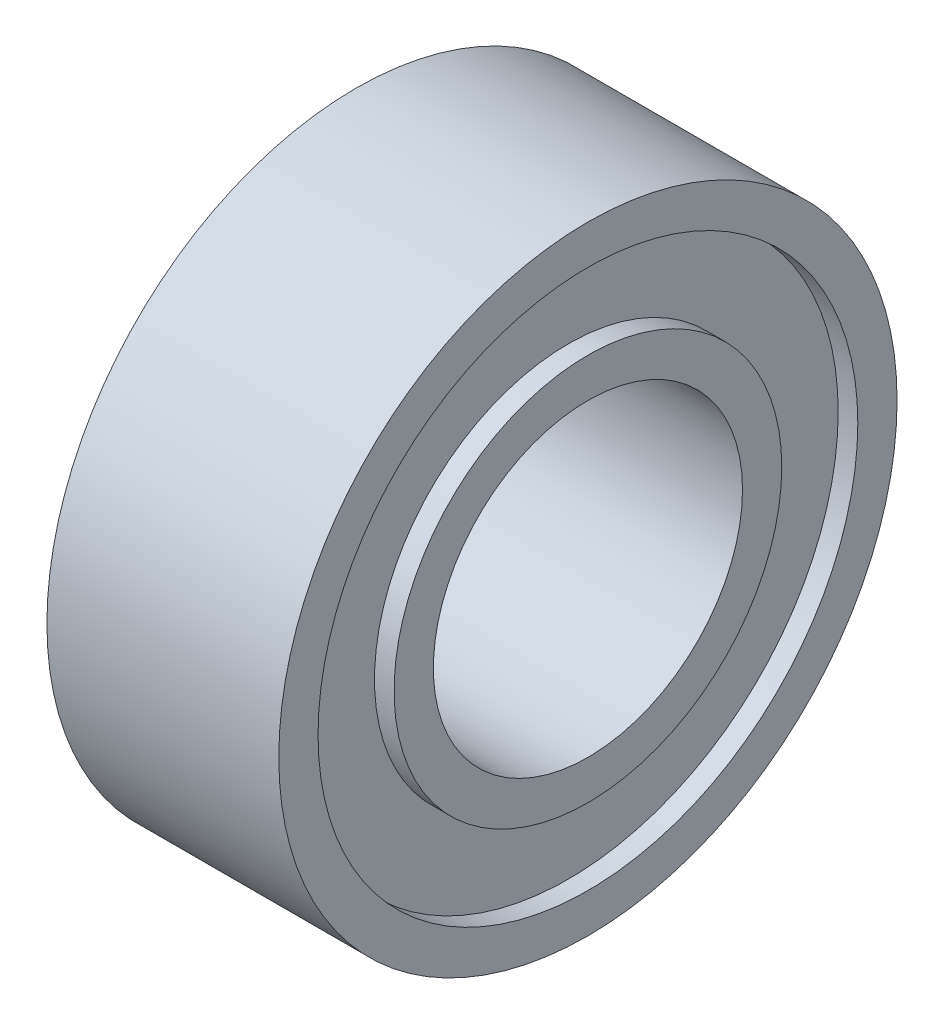
ISO-10303-21;
HEADER;
FILE_DESCRIPTION(('STEP AP214'),'2;1');
FILE_NAME('part.step','',(''),(''),'','','');
FILE_SCHEMA(('AUTOMOTIVE_DESIGN { 1 0 10303 214 1 1 1 1 }'));
ENDSEC;
DATA;
#1=APPLICATION_CONTEXT('core data for automotive mechanical design processes');
#2=APPLICATION_PROTOCOL_DEFINITION('international standard','automotive_design',2000,#1);
#3=PRODUCT_CONTEXT('',#1,'mechanical');
#4=PRODUCT('Part','Part','',(#3));
#5=PRODUCT_RELATED_PRODUCT_CATEGORY('part','',(#4));
#6=PRODUCT_DEFINITION_FORMATION('','',#4);
#7=PRODUCT_DEFINITION_CONTEXT('part definition',#1,'design');
#8=PRODUCT_DEFINITION('design','',#6,#7);
#9=PRODUCT_DEFINITION_SHAPE('','',#8);
#10=(LENGTH_UNIT() NAMED_UNIT(*) SI_UNIT(.MILLI.,.METRE.));
#11=(NAMED_UNIT(*) PLANE_ANGLE_UNIT() SI_UNIT($,.RADIAN.));
#12=(NAMED_UNIT(*) SI_UNIT($,.STERADIAN.) SOLID_ANGLE_UNIT());
#13=UNCERTAINTY_MEASURE_WITH_UNIT(LENGTH_MEASURE(1.E-05),#10,'distance_accuracy_value','');
#14=(GEOMETRIC_REPRESENTATION_CONTEXT(3) GLOBAL_UNCERTAINTY_ASSIGNED_CONTEXT((#13)) GLOBAL_UNIT_ASSIGNED_CONTEXT((#10,
#11,#12)) REPRESENTATION_CONTEXT('',''));
#15=CARTESIAN_POINT('',(0.,0.,0.));
#16=DIRECTION('',(0.,0.,1.));
#17=DIRECTION('',(1.,0.,0.));
#18=AXIS2_PLACEMENT_3D('',#15,#16,#17);
#19=CARTESIAN_POINT('',(-1.5,0.,0.));
#20=DIRECTION('',(1.,0.,0.));
#21=DIRECTION('',(0.,0.,-1.));
#22=AXIS2_PLACEMENT_3D('',#19,#20,#21);
#23=PLANE('',#22);
#24=CARTESIAN_POINT('',(-1.5,0.,0.));
#25=DIRECTION('',(1.,0.,0.));
#26=DIRECTION('',(0.,0.,-1.));
#27=AXIS2_PLACEMENT_3D('',#24,#25,#26);
#28=CIRCLE('',#27,2.);
#29=CARTESIAN_POINT('',(-1.5,0.,-2.));
#30=VERTEX_POINT('',#29);
#31=EDGE_CURVE('E58',#30,#30,#28,.T.);
#32=ORIENTED_EDGE('',*,*,#31,.T.);
#33=EDGE_LOOP('',(#32));
#34=FACE_BOUND('',#33,.T.);
#35=CARTESIAN_POINT('',(-1.5,0.,0.));
#36=DIRECTION('',(1.,0.,0.));
#37=DIRECTION('',(0.,0.,-1.));
#38=AXIS2_PLACEMENT_3D('',#35,#36,#37);
#39=CIRCLE('',#38,2.508);
#40=CARTESIAN_POINT('',(-1.5,0.,-2.508));
#41=VERTEX_POINT('',#40);
#42=EDGE_CURVE('E90',#41,#41,#39,.T.);
#43=ORIENTED_EDGE('',*,*,#42,.F.);
#44=EDGE_LOOP('',(#43));
#45=FACE_BOUND('',#44,.T.);
#46=ADVANCED_FACE('F43',(#34,#45),#23,.F.);
#47=CARTESIAN_POINT('',(1.5,0.,0.));
#48=DIRECTION('',(1.,0.,0.));
#49=DIRECTION('',(0.,0.,-1.));
#50=AXIS2_PLACEMENT_3D('',#47,#48,#49);
#51=PLANE('',#50);
#52=CARTESIAN_POINT('',(1.5,0.,0.));
#53=DIRECTION('',(1.,0.,0.));
#54=DIRECTION('',(0.,0.,-1.));
#55=AXIS2_PLACEMENT_3D('',#52,#53,#54);
#56=CIRCLE('',#55,2.);
#57=CARTESIAN_POINT('',(1.5,0.,-2.));
#58=VERTEX_POINT('',#57);
#59=EDGE_CURVE('E56',#58,#58,#56,.T.);
#60=ORIENTED_EDGE('',*,*,#59,.F.);
#61=EDGE_LOOP('',(#60));
#62=FACE_BOUND('',#61,.T.);
#63=CARTESIAN_POINT('',(1.5,0.,0.));
#64=DIRECTION('',(1.,0.,0.));
#65=DIRECTION('',(0.,0.,-1.));
#66=AXIS2_PLACEMENT_3D('',#63,#64,#65);
#67=CIRCLE('',#66,2.508);
#68=CARTESIAN_POINT('',(1.5,0.,-2.508));
#69=VERTEX_POINT('',#68);
#70=EDGE_CURVE('E74',#69,#69,#67,.T.);
#71=ORIENTED_EDGE('',*,*,#70,.T.);
#72=EDGE_LOOP('',(#71));
#73=FACE_BOUND('',#72,.T.);
#74=ADVANCED_FACE('F108',(#62,#73),#51,.T.);
#75=CARTESIAN_POINT('',(1.5,0.,0.));
#76=DIRECTION('',(1.,0.,0.));
#77=DIRECTION('',(0.,0.,-1.));
#78=AXIS2_PLACEMENT_3D('',#75,#76,#77);
#79=CIRCLE('',#78,3.492);
#80=CARTESIAN_POINT('',(1.5,0.,-3.492));
#81=VERTEX_POINT('',#80);
#82=EDGE_CURVE('E66',#81,#81,#79,.T.);
#83=ORIENTED_EDGE('',*,*,#82,.F.);
#84=EDGE_LOOP('',(#83));
#85=FACE_BOUND('',#84,.T.);
#86=CARTESIAN_POINT('',(1.5,0.,0.));
#87=DIRECTION('',(1.,0.,0.));
#88=DIRECTION('',(0.,0.,-1.));
#89=AXIS2_PLACEMENT_3D('',#86,#87,#88);
#90=CIRCLE('',#89,4.);
#91=CARTESIAN_POINT('',(1.5,0.,-4.));
#92=VERTEX_POINT('',#91);
#93=EDGE_CURVE('E10',#92,#92,#90,.T.);
#94=ORIENTED_EDGE('',*,*,#93,.T.);
#95=EDGE_LOOP('',(#94));
#96=FACE_BOUND('',#95,.T.);
#97=ADVANCED_FACE('F116',(#85,#96),#51,.T.);
#98=CARTESIAN_POINT('',(-1.5,0.,0.));
#99=DIRECTION('',(1.,0.,0.));
#100=DIRECTION('',(0.,0.,-1.));
#101=AXIS2_PLACEMENT_3D('',#98,#99,#100);
#102=CIRCLE('',#101,3.492);
#103=CARTESIAN_POINT('',(-1.5,0.,-3.492));
#104=VERTEX_POINT('',#103);
#105=EDGE_CURVE('E82',#104,#104,#102,.T.);
#106=ORIENTED_EDGE('',*,*,#105,.T.);
#107=EDGE_LOOP('',(#106));
#108=FACE_BOUND('',#107,.T.);
#109=CARTESIAN_POINT('',(-1.5,0.,0.));
#110=DIRECTION('',(1.,0.,0.));
#111=DIRECTION('',(0.,0.,-1.));
#112=AXIS2_PLACEMENT_3D('',#109,#110,#111);
#113=CIRCLE('',#112,4.);
#114=CARTESIAN_POINT('',(-1.5,0.,-4.));
#115=VERTEX_POINT('',#114);
#116=EDGE_CURVE('E47',#115,#115,#113,.T.);
#117=ORIENTED_EDGE('',*,*,#116,.F.);
#118=EDGE_LOOP('',(#117));
#119=FACE_BOUND('',#118,.T.);
#120=ADVANCED_FACE('F110',(#108,#119),#23,.F.);
#121=CARTESIAN_POINT('',(1.5,0.,0.));
#122=DIRECTION('',(-1.,0.,0.));
#123=DIRECTION('',(0.,0.,1.));
#124=AXIS2_PLACEMENT_3D('',#121,#122,#123);
#125=CYLINDRICAL_SURFACE('',#124,4.);
#126=ORIENTED_EDGE('',*,*,#93,.F.);
#127=EDGE_LOOP('',(#126));
#128=FACE_BOUND('',#127,.T.);
#129=ORIENTED_EDGE('',*,*,#116,.T.);
#130=EDGE_LOOP('',(#129));
#131=FACE_BOUND('',#130,.T.);
#132=ADVANCED_FACE('F45',(#128,#131),#125,.T.);
#133=CARTESIAN_POINT('',(1.5,0.,0.));
#134=DIRECTION('',(-1.,0.,0.));
#135=DIRECTION('',(0.,0.,1.));
#136=AXIS2_PLACEMENT_3D('',#133,#134,#135);
#137=CYLINDRICAL_SURFACE('',#136,2.);
#138=ORIENTED_EDGE('',*,*,#59,.T.);
#139=EDGE_LOOP('',(#138));
#140=FACE_BOUND('',#139,.T.);
#141=ORIENTED_EDGE('',*,*,#31,.F.);
#142=EDGE_LOOP('',(#141));
#143=FACE_BOUND('',#142,.T.);
#144=ADVANCED_FACE('F124',(#140,#143),#137,.F.);
#145=CARTESIAN_POINT('',(1.246,0.,0.));
#146=DIRECTION('',(1.,0.,0.));
#147=DIRECTION('',(0.,0.,-1.));
#148=AXIS2_PLACEMENT_3D('',#145,#146,#147);
#149=CYLINDRICAL_SURFACE('',#148,3.492);
#150=CARTESIAN_POINT('',(1.246,0.,0.));
#151=DIRECTION('',(1.,0.,0.));
#152=DIRECTION('',(0.,0.,-1.));
#153=AXIS2_PLACEMENT_3D('',#150,#151,#152);
#154=CIRCLE('',#153,3.492);
#155=CARTESIAN_POINT('',(1.246,0.,-3.492));
#156=VERTEX_POINT('',#155);
#157=EDGE_CURVE('E62',#156,#156,#154,.T.);
#158=ORIENTED_EDGE('',*,*,#157,.F.);
#159=EDGE_LOOP('',(#158));
#160=FACE_BOUND('',#159,.T.);
#161=ORIENTED_EDGE('',*,*,#82,.T.);
#162=EDGE_LOOP('',(#161));
#163=FACE_BOUND('',#162,.T.);
#164=ADVANCED_FACE('F147',(#160,#163),#149,.F.);
#165=CARTESIAN_POINT('',(1.246,0.,0.));
#166=DIRECTION('',(1.,0.,0.));
#167=DIRECTION('',(0.,0.,-1.));
#168=AXIS2_PLACEMENT_3D('',#165,#166,#167);
#169=PLANE('',#168);
#170=CARTESIAN_POINT('',(1.246,0.,0.));
#171=DIRECTION('',(1.,0.,0.));
#172=DIRECTION('',(0.,0.,-1.));
#173=AXIS2_PLACEMENT_3D('',#170,#171,#172);
#174=CIRCLE('',#173,2.508);
#175=CARTESIAN_POINT('',(1.246,0.,-2.508));
#176=VERTEX_POINT('',#175);
#177=EDGE_CURVE('E70',#176,#176,#174,.T.);
#178=ORIENTED_EDGE('',*,*,#177,.F.);
#179=EDGE_LOOP('',(#178));
#180=FACE_BOUND('',#179,.T.);
#181=ORIENTED_EDGE('',*,*,#157,.T.);
#182=EDGE_LOOP('',(#181));
#183=FACE_BOUND('',#182,.T.);
#184=ADVANCED_FACE('F143',(#180,#183),#169,.T.);
#185=CARTESIAN_POINT('',(1.246,0.,0.));
#186=DIRECTION('',(1.,0.,0.));
#187=DIRECTION('',(0.,0.,-1.));
#188=AXIS2_PLACEMENT_3D('',#185,#186,#187);
#189=CYLINDRICAL_SURFACE('',#188,2.508);
#190=ORIENTED_EDGE('',*,*,#177,.T.);
#191=EDGE_LOOP('',(#190));
#192=FACE_BOUND('',#191,.T.);
#193=ORIENTED_EDGE('',*,*,#70,.F.);
#194=EDGE_LOOP('',(#193));
#195=FACE_BOUND('',#194,.T.);
#196=ADVANCED_FACE('F138',(#192,#195),#189,.T.);
#197=CARTESIAN_POINT('',(-1.246,0.,0.));
#198=DIRECTION('',(-1.,0.,0.));
#199=DIRECTION('',(0.,0.,-1.));
#200=AXIS2_PLACEMENT_3D('',#197,#198,#199);
#201=PLANE('',#200);
#202=CARTESIAN_POINT('',(-1.246,0.,0.));
#203=DIRECTION('',(1.,0.,0.));
#204=DIRECTION('',(0.,0.,-1.));
#205=AXIS2_PLACEMENT_3D('',#202,#203,#204);
#206=CIRCLE('',#205,3.492);
#207=CARTESIAN_POINT('',(-1.246,0.,-3.492));
#208=VERTEX_POINT('',#207);
#209=EDGE_CURVE('E78',#208,#208,#206,.T.);
#210=ORIENTED_EDGE('',*,*,#209,.F.);
#211=EDGE_LOOP('',(#210));
#212=FACE_BOUND('',#211,.T.);
#213=CARTESIAN_POINT('',(-1.246,0.,0.));
#214=DIRECTION('',(1.,0.,0.));
#215=DIRECTION('',(0.,0.,-1.));
#216=AXIS2_PLACEMENT_3D('',#213,#214,#215);
#217=CIRCLE('',#216,2.508);
#218=CARTESIAN_POINT('',(-1.246,0.,-2.508));
#219=VERTEX_POINT('',#218);
#220=EDGE_CURVE('E86',#219,#219,#217,.T.);
#221=ORIENTED_EDGE('',*,*,#220,.T.);
#222=EDGE_LOOP('',(#221));
#223=FACE_BOUND('',#222,.T.);
#224=ADVANCED_FACE('F98',(#212,#223),#201,.T.);
#225=CARTESIAN_POINT('',(-1.246,0.,0.));
#226=DIRECTION('',(-1.,0.,0.));
#227=DIRECTION('',(0.,0.,1.));
#228=AXIS2_PLACEMENT_3D('',#225,#226,#227);
#229=CYLINDRICAL_SURFACE('',#228,3.492);
#230=ORIENTED_EDGE('',*,*,#209,.T.);
#231=EDGE_LOOP('',(#230));
#232=FACE_BOUND('',#231,.T.);
#233=ORIENTED_EDGE('',*,*,#105,.F.);
#234=EDGE_LOOP('',(#233));
#235=FACE_BOUND('',#234,.T.);
#236=ADVANCED_FACE('F103',(#232,#235),#229,.F.);
#237=CARTESIAN_POINT('',(-1.246,0.,0.));
#238=DIRECTION('',(-1.,0.,0.));
#239=DIRECTION('',(0.,0.,1.));
#240=AXIS2_PLACEMENT_3D('',#237,#238,#239);
#241=CYLINDRICAL_SURFACE('',#240,2.508);
#242=ORIENTED_EDGE('',*,*,#220,.F.);
#243=EDGE_LOOP('',(#242));
#244=FACE_BOUND('',#243,.T.);
#245=ORIENTED_EDGE('',*,*,#42,.T.);
#246=EDGE_LOOP('',(#245));
#247=FACE_BOUND('',#246,.T.);
#248=ADVANCED_FACE('F100',(#244,#247),#241,.T.);
#249=CLOSED_SHELL('',(#46,#74,#97,#120,#132,#144,#164,#184,#196,#224,#236,#248));
#250=MANIFOLD_SOLID_BREP('B2',#249);
#251=ADVANCED_BREP_SHAPE_REPRESENTATION('',(#18,#250),#14);
#252=SHAPE_DEFINITION_REPRESENTATION(#9,#251);
ENDSEC;
END-ISO-10303-21;
